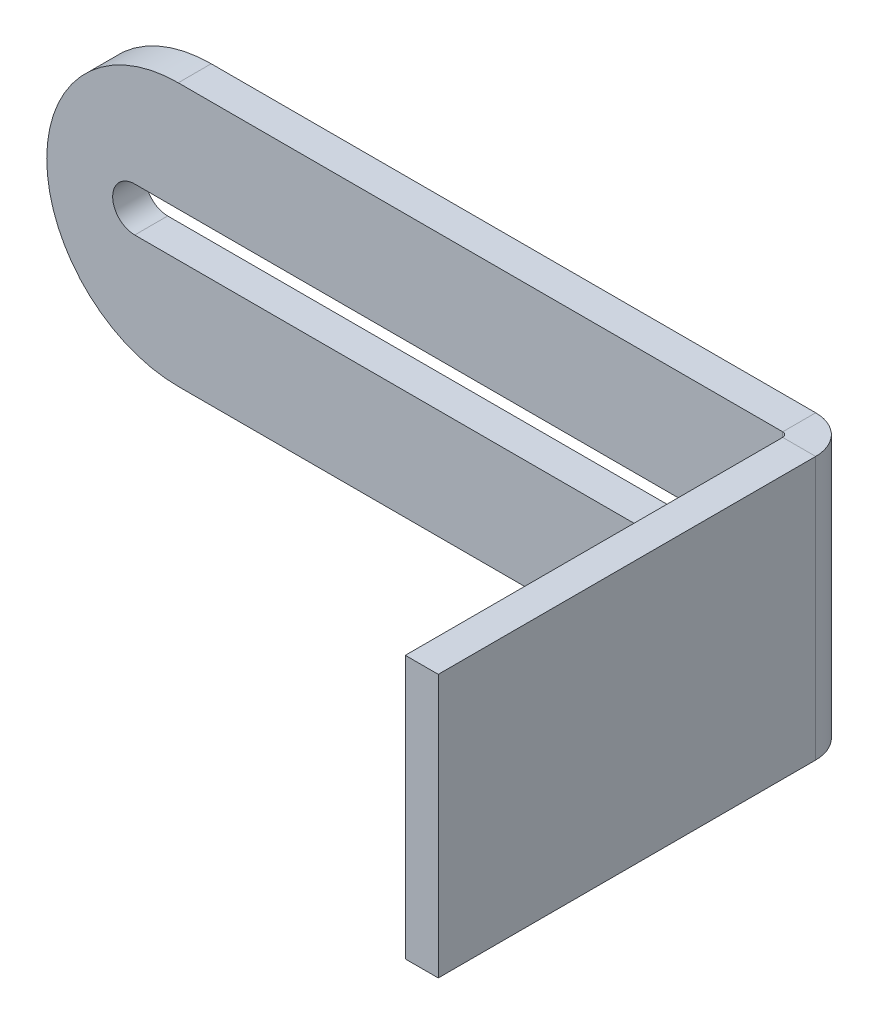
ISO-10303-21;
HEADER;
FILE_DESCRIPTION(('STEP AP214'),'2;1');
FILE_NAME('part.step','',(''),(''),'','','');
FILE_SCHEMA(('AUTOMOTIVE_DESIGN { 1 0 10303 214 1 1 1 1 }'));
ENDSEC;
DATA;
#1=APPLICATION_CONTEXT('core data for automotive mechanical design processes');
#2=APPLICATION_PROTOCOL_DEFINITION('international standard','automotive_design',2000,#1);
#3=PRODUCT_CONTEXT('',#1,'mechanical');
#4=PRODUCT('Part','Part','',(#3));
#5=PRODUCT_RELATED_PRODUCT_CATEGORY('part','',(#4));
#6=PRODUCT_DEFINITION_FORMATION('','',#4);
#7=PRODUCT_DEFINITION_CONTEXT('part definition',#1,'design');
#8=PRODUCT_DEFINITION('design','',#6,#7);
#9=PRODUCT_DEFINITION_SHAPE('','',#8);
#10=(LENGTH_UNIT() NAMED_UNIT(*) SI_UNIT(.MILLI.,.METRE.));
#11=(NAMED_UNIT(*) PLANE_ANGLE_UNIT() SI_UNIT($,.RADIAN.));
#12=(NAMED_UNIT(*) SI_UNIT($,.STERADIAN.) SOLID_ANGLE_UNIT());
#13=UNCERTAINTY_MEASURE_WITH_UNIT(LENGTH_MEASURE(1.E-05),#10,'distance_accuracy_value','');
#14=(GEOMETRIC_REPRESENTATION_CONTEXT(3) GLOBAL_UNCERTAINTY_ASSIGNED_CONTEXT((#13)) GLOBAL_UNIT_ASSIGNED_CONTEXT((#10,
#11,#12)) REPRESENTATION_CONTEXT('',''));
#15=CARTESIAN_POINT('',(0.,0.,0.));
#16=DIRECTION('',(0.,0.,1.));
#17=DIRECTION('',(1.,0.,0.));
#18=AXIS2_PLACEMENT_3D('',#15,#16,#17);
#19=CARTESIAN_POINT('',(0.,0.,-5.));
#20=DIRECTION('',(0.,0.,-1.));
#21=DIRECTION('',(-1.,0.,0.));
#22=AXIS2_PLACEMENT_3D('',#19,#20,#21);
#23=PLANE('',#22);
#24=DIRECTION('',(1.,0.,0.));
#25=VECTOR('',#24,1.);
#26=CARTESIAN_POINT('',(0.,3.35,-5.));
#27=LINE('',#26,#25);
#28=CARTESIAN_POINT('',(-45.35,3.35,-5.));
#29=VERTEX_POINT('',#28);
#30=CARTESIAN_POINT('',(42.8500000000002,3.35,-5.));
#31=VERTEX_POINT('',#30);
#32=EDGE_CURVE('E229',#29,#31,#27,.T.);
#33=ORIENTED_EDGE('',*,*,#32,.F.);
#34=CARTESIAN_POINT('',(-45.35,0.,-5.));
#35=DIRECTION('',(0.,0.,-1.));
#36=DIRECTION('',(-1.,0.,0.));
#37=AXIS2_PLACEMENT_3D('',#34,#35,#36);
#38=CIRCLE('',#37,3.35);
#39=CARTESIAN_POINT('',(-45.35,-3.35,-5.));
#40=VERTEX_POINT('',#39);
#41=EDGE_CURVE('E224',#40,#29,#38,.T.);
#42=ORIENTED_EDGE('',*,*,#41,.F.);
#43=DIRECTION('',(1.,0.,0.));
#44=VECTOR('',#43,1.);
#45=CARTESIAN_POINT('',(0.,-3.35,-5.));
#46=LINE('',#45,#44);
#47=CARTESIAN_POINT('',(42.8500000000002,-3.35,-5.));
#48=VERTEX_POINT('',#47);
#49=EDGE_CURVE('E199',#40,#48,#46,.T.);
#50=ORIENTED_EDGE('',*,*,#49,.T.);
#51=CARTESIAN_POINT('',(42.8500000000002,0.,-5.));
#52=DIRECTION('',(0.,0.,-1.));
#53=DIRECTION('',(-1.,0.,0.));
#54=AXIS2_PLACEMENT_3D('',#51,#52,#53);
#55=CIRCLE('',#54,3.35);
#56=EDGE_CURVE('E227',#31,#48,#55,.T.);
#57=ORIENTED_EDGE('',*,*,#56,.F.);
#58=EDGE_LOOP('',(#33,#42,#50,#57));
#59=FACE_BOUND('',#58,.T.);
#60=DIRECTION('',(1.,0.,0.));
#61=VECTOR('',#60,1.);
#62=CARTESIAN_POINT('',(-58.7,-19.95,-5.));
#63=LINE('',#62,#61);
#64=CARTESIAN_POINT('',(-38.75,-19.95,-5.));
#65=VERTEX_POINT('',#64);
#66=CARTESIAN_POINT('',(52.9634,-19.95,-5.));
#67=VERTEX_POINT('',#66);
#68=EDGE_CURVE('E13',#65,#67,#63,.T.);
#69=ORIENTED_EDGE('',*,*,#68,.F.);
#70=CARTESIAN_POINT('',(-38.75,0.,-5.));
#71=DIRECTION('',(0.,0.,-1.));
#72=DIRECTION('',(-1.,0.,0.));
#73=AXIS2_PLACEMENT_3D('',#70,#71,#72);
#74=CIRCLE('',#73,19.95);
#75=CARTESIAN_POINT('',(-38.75,19.95,-5.));
#76=VERTEX_POINT('',#75);
#77=EDGE_CURVE('E236',#65,#76,#74,.T.);
#78=ORIENTED_EDGE('',*,*,#77,.T.);
#79=DIRECTION('',(-1.,0.,0.));
#80=VECTOR('',#79,1.);
#81=CARTESIAN_POINT('',(-58.7,19.95,-5.));
#82=LINE('',#81,#80);
#83=CARTESIAN_POINT('',(52.9634,19.95,-5.));
#84=VERTEX_POINT('',#83);
#85=EDGE_CURVE('E112',#84,#76,#82,.T.);
#86=ORIENTED_EDGE('',*,*,#85,.F.);
#87=DIRECTION('',(0.,1.,0.));
#88=VECTOR('',#87,1.);
#89=CARTESIAN_POINT('',(52.9634,19.95,-5.));
#90=LINE('',#89,#88);
#91=EDGE_CURVE('E272',#84,#67,#90,.F.);
#92=ORIENTED_EDGE('',*,*,#91,.T.);
#93=EDGE_LOOP('',(#69,#78,#86,#92));
#94=FACE_BOUND('',#93,.T.);
#95=ADVANCED_FACE('F103',(#59,#94),#23,.T.);
#96=CARTESIAN_POINT('',(0.,0.,0.));
#97=DIRECTION('',(0.,0.,-1.));
#98=DIRECTION('',(-1.,0.,0.));
#99=AXIS2_PLACEMENT_3D('',#96,#97,#98);
#100=PLANE('',#99);
#101=CARTESIAN_POINT('',(-45.35,0.,0.));
#102=DIRECTION('',(0.,0.,1.));
#103=DIRECTION('',(1.,0.,0.));
#104=AXIS2_PLACEMENT_3D('',#101,#102,#103);
#105=CIRCLE('',#104,3.35);
#106=CARTESIAN_POINT('',(-45.35,3.35,0.));
#107=VERTEX_POINT('',#106);
#108=CARTESIAN_POINT('',(-45.35,-3.35,0.));
#109=VERTEX_POINT('',#108);
#110=EDGE_CURVE('E205',#107,#109,#105,.T.);
#111=ORIENTED_EDGE('',*,*,#110,.F.);
#112=DIRECTION('',(-1.,0.,0.));
#113=VECTOR('',#112,1.);
#114=CARTESIAN_POINT('',(0.,3.35,0.));
#115=LINE('',#114,#113);
#116=CARTESIAN_POINT('',(42.8500000000002,3.35,0.));
#117=VERTEX_POINT('',#116);
#118=EDGE_CURVE('E128',#117,#107,#115,.T.);
#119=ORIENTED_EDGE('',*,*,#118,.F.);
#120=CARTESIAN_POINT('',(42.8500000000002,0.,0.));
#121=DIRECTION('',(0.,0.,1.));
#122=DIRECTION('',(1.,0.,0.));
#123=AXIS2_PLACEMENT_3D('',#120,#121,#122);
#124=CIRCLE('',#123,3.35);
#125=CARTESIAN_POINT('',(42.8500000000002,-3.35,0.));
#126=VERTEX_POINT('',#125);
#127=EDGE_CURVE('E212',#126,#117,#124,.T.);
#128=ORIENTED_EDGE('',*,*,#127,.F.);
#129=DIRECTION('',(-1.,0.,0.));
#130=VECTOR('',#129,1.);
#131=CARTESIAN_POINT('',(0.,-3.35,0.));
#132=LINE('',#131,#130);
#133=EDGE_CURVE('E196',#126,#109,#132,.T.);
#134=ORIENTED_EDGE('',*,*,#133,.T.);
#135=EDGE_LOOP('',(#111,#119,#128,#134));
#136=FACE_BOUND('',#135,.T.);
#137=CARTESIAN_POINT('',(-38.75,0.,0.));
#138=DIRECTION('',(0.,0.,1.));
#139=DIRECTION('',(1.,0.,0.));
#140=AXIS2_PLACEMENT_3D('',#137,#138,#139);
#141=CIRCLE('',#140,19.95);
#142=CARTESIAN_POINT('',(-38.75,19.95,0.));
#143=VERTEX_POINT('',#142);
#144=CARTESIAN_POINT('',(-38.75,-19.95,0.));
#145=VERTEX_POINT('',#144);
#146=EDGE_CURVE('E231',#143,#145,#141,.T.);
#147=ORIENTED_EDGE('',*,*,#146,.T.);
#148=DIRECTION('',(1.,0.,0.));
#149=VECTOR('',#148,1.);
#150=CARTESIAN_POINT('',(-58.7,-19.95,0.));
#151=LINE('',#150,#149);
#152=CARTESIAN_POINT('',(52.9634,-19.95,0.));
#153=VERTEX_POINT('',#152);
#154=EDGE_CURVE('E107',#145,#153,#151,.T.);
#155=ORIENTED_EDGE('',*,*,#154,.T.);
#156=DIRECTION('',(0.,1.,0.));
#157=VECTOR('',#156,1.);
#158=CARTESIAN_POINT('',(52.9634,19.95,0.));
#159=LINE('',#158,#157);
#160=CARTESIAN_POINT('',(52.9634,19.95,0.));
#161=VERTEX_POINT('',#160);
#162=EDGE_CURVE('E285',#161,#153,#159,.F.);
#163=ORIENTED_EDGE('',*,*,#162,.F.);
#164=DIRECTION('',(-1.,0.,0.));
#165=VECTOR('',#164,1.);
#166=CARTESIAN_POINT('',(-58.7,19.95,0.));
#167=LINE('',#166,#165);
#168=EDGE_CURVE('E293',#161,#143,#167,.T.);
#169=ORIENTED_EDGE('',*,*,#168,.T.);
#170=EDGE_LOOP('',(#147,#155,#163,#169));
#171=FACE_BOUND('',#170,.T.);
#172=ADVANCED_FACE('F209',(#136,#171),#100,.F.);
#173=CARTESIAN_POINT('',(-58.7,19.95,-5.));
#174=DIRECTION('',(0.,1.,0.));
#175=DIRECTION('',(0.,0.,1.));
#176=AXIS2_PLACEMENT_3D('',#173,#174,#175);
#177=PLANE('',#176);
#178=ORIENTED_EDGE('',*,*,#85,.T.);
#179=DIRECTION('',(0.,0.,1.));
#180=VECTOR('',#179,1.);
#181=CARTESIAN_POINT('',(-38.75,19.95,-10.));
#182=LINE('',#181,#180);
#183=EDGE_CURVE('E233',#76,#143,#182,.T.);
#184=ORIENTED_EDGE('',*,*,#183,.T.);
#185=ORIENTED_EDGE('',*,*,#168,.F.);
#186=DIRECTION('',(0.,0.,-1.));
#187=VECTOR('',#186,1.);
#188=CARTESIAN_POINT('',(52.9634,19.95,0.));
#189=LINE('',#188,#187);
#190=EDGE_CURVE('E279',#161,#84,#189,.T.);
#191=ORIENTED_EDGE('',*,*,#190,.T.);
#192=EDGE_LOOP('',(#178,#184,#185,#191));
#193=FACE_BOUND('',#192,.T.);
#194=ADVANCED_FACE('F105',(#193),#177,.T.);
#195=CARTESIAN_POINT('',(-58.7,-19.95,-5.));
#196=DIRECTION('',(0.,-1.,0.));
#197=DIRECTION('',(0.,0.,-1.));
#198=AXIS2_PLACEMENT_3D('',#195,#196,#197);
#199=PLANE('',#198);
#200=DIRECTION('',(0.,0.,1.));
#201=VECTOR('',#200,1.);
#202=CARTESIAN_POINT('',(-38.75,-19.95,-10.));
#203=LINE('',#202,#201);
#204=EDGE_CURVE('E219',#65,#145,#203,.T.);
#205=ORIENTED_EDGE('',*,*,#204,.F.);
#206=ORIENTED_EDGE('',*,*,#68,.T.);
#207=DIRECTION('',(0.,0.,-1.));
#208=VECTOR('',#207,1.);
#209=CARTESIAN_POINT('',(52.9634,-19.95,0.));
#210=LINE('',#209,#208);
#211=EDGE_CURVE('E290',#153,#67,#210,.T.);
#212=ORIENTED_EDGE('',*,*,#211,.F.);
#213=ORIENTED_EDGE('',*,*,#154,.F.);
#214=EDGE_LOOP('',(#205,#206,#212,#213));
#215=FACE_BOUND('',#214,.T.);
#216=ADVANCED_FACE('F311',(#215),#199,.T.);
#217=CARTESIAN_POINT('',(52.9634,-19.95,0.7366));
#218=DIRECTION('',(0.,-1.,0.));
#219=DIRECTION('',(0.,0.,-1.));
#220=AXIS2_PLACEMENT_3D('',#217,#218,#219);
#221=PLANE('',#220);
#222=DIRECTION('',(1.,0.,0.));
#223=VECTOR('',#222,1.);
#224=CARTESIAN_POINT('',(58.7,-19.95,0.736599999999976));
#225=LINE('',#224,#223);
#226=CARTESIAN_POINT('',(53.7,-19.95,0.736599999999997));
#227=VERTEX_POINT('',#226);
#228=CARTESIAN_POINT('',(58.7,-19.95,0.736599999999979));
#229=VERTEX_POINT('',#228);
#230=EDGE_CURVE('E239',#227,#229,#225,.T.);
#231=ORIENTED_EDGE('',*,*,#230,.F.);
#232=CARTESIAN_POINT('',(52.9634,-19.95,0.7366));
#233=DIRECTION('',(0.,1.,0.));
#234=DIRECTION('',(0.,0.,1.));
#235=AXIS2_PLACEMENT_3D('',#232,#233,#234);
#236=CIRCLE('',#235,0.736600000000004);
#237=EDGE_CURVE('E282',#153,#227,#236,.F.);
#238=ORIENTED_EDGE('',*,*,#237,.F.);
#239=ORIENTED_EDGE('',*,*,#211,.T.);
#240=CARTESIAN_POINT('',(52.9634,-19.95,0.7366));
#241=DIRECTION('',(0.,1.,0.));
#242=DIRECTION('',(0.,0.,1.));
#243=AXIS2_PLACEMENT_3D('',#240,#241,#242);
#244=CIRCLE('',#243,5.7366);
#245=EDGE_CURVE('E275',#67,#229,#244,.F.);
#246=ORIENTED_EDGE('',*,*,#245,.T.);
#247=EDGE_LOOP('',(#231,#238,#239,#246));
#248=FACE_BOUND('',#247,.T.);
#249=ADVANCED_FACE('F310',(#248),#221,.T.);
#250=CARTESIAN_POINT('',(52.9634,19.95,0.7366));
#251=DIRECTION('',(0.,-1.,0.));
#252=DIRECTION('',(0.,0.,-1.));
#253=AXIS2_PLACEMENT_3D('',#250,#251,#252);
#254=PLANE('',#253);
#255=CARTESIAN_POINT('',(52.9634,19.95,0.7366));
#256=DIRECTION('',(0.,1.,0.));
#257=DIRECTION('',(0.,0.,1.));
#258=AXIS2_PLACEMENT_3D('',#255,#256,#257);
#259=CIRCLE('',#258,0.736600000000004);
#260=CARTESIAN_POINT('',(53.7,19.95,0.736599999999997));
#261=VERTEX_POINT('',#260);
#262=EDGE_CURVE('E242',#261,#161,#259,.T.);
#263=ORIENTED_EDGE('',*,*,#262,.F.);
#264=DIRECTION('',(1.,0.,0.));
#265=VECTOR('',#264,1.);
#266=CARTESIAN_POINT('',(53.7,19.95,0.736599999999997));
#267=LINE('',#266,#265);
#268=CARTESIAN_POINT('',(58.7,19.95,0.736599999999979));
#269=VERTEX_POINT('',#268);
#270=EDGE_CURVE('E265',#261,#269,#267,.T.);
#271=ORIENTED_EDGE('',*,*,#270,.T.);
#272=CARTESIAN_POINT('',(52.9634,19.95,0.7366));
#273=DIRECTION('',(0.,1.,0.));
#274=DIRECTION('',(0.,0.,1.));
#275=AXIS2_PLACEMENT_3D('',#272,#273,#274);
#276=CIRCLE('',#275,5.7366);
#277=EDGE_CURVE('E276',#269,#84,#276,.T.);
#278=ORIENTED_EDGE('',*,*,#277,.T.);
#279=ORIENTED_EDGE('',*,*,#190,.F.);
#280=EDGE_LOOP('',(#263,#271,#278,#279));
#281=FACE_BOUND('',#280,.T.);
#282=ADVANCED_FACE('F336',(#281),#254,.F.);
#283=CARTESIAN_POINT('',(52.9634,19.95,0.7366));
#284=DIRECTION('',(0.,1.,0.));
#285=DIRECTION('',(1.,0.,0.));
#286=AXIS2_PLACEMENT_3D('',#283,#284,#285);
#287=CYLINDRICAL_SURFACE('',#286,5.7366);
#288=ORIENTED_EDGE('',*,*,#91,.F.);
#289=ORIENTED_EDGE('',*,*,#277,.F.);
#290=DIRECTION('',(0.,1.,0.));
#291=VECTOR('',#290,1.);
#292=CARTESIAN_POINT('',(58.7,0.,0.736599999999979));
#293=LINE('',#292,#291);
#294=EDGE_CURVE('E262',#229,#269,#293,.T.);
#295=ORIENTED_EDGE('',*,*,#294,.F.);
#296=ORIENTED_EDGE('',*,*,#245,.F.);
#297=EDGE_LOOP('',(#288,#289,#295,#296));
#298=FACE_BOUND('',#297,.T.);
#299=ADVANCED_FACE('F316',(#298),#287,.T.);
#300=CARTESIAN_POINT('',(52.9634,19.95,0.7366));
#301=DIRECTION('',(0.,1.,0.));
#302=DIRECTION('',(1.,0.,0.));
#303=AXIS2_PLACEMENT_3D('',#300,#301,#302);
#304=CYLINDRICAL_SURFACE('',#303,0.736600000000004);
#305=ORIENTED_EDGE('',*,*,#162,.T.);
#306=ORIENTED_EDGE('',*,*,#237,.T.);
#307=DIRECTION('',(0.,-1.,0.));
#308=VECTOR('',#307,1.);
#309=CARTESIAN_POINT('',(53.7,-19.95,0.736599999999997));
#310=LINE('',#309,#308);
#311=EDGE_CURVE('E268',#227,#261,#310,.F.);
#312=ORIENTED_EDGE('',*,*,#311,.T.);
#313=ORIENTED_EDGE('',*,*,#262,.T.);
#314=EDGE_LOOP('',(#305,#306,#312,#313));
#315=FACE_BOUND('',#314,.T.);
#316=ADVANCED_FACE('F306',(#315),#304,.F.);
#317=CARTESIAN_POINT('',(58.7,19.95,0.));
#318=DIRECTION('',(0.,1.,0.));
#319=DIRECTION('',(0.,0.,1.));
#320=AXIS2_PLACEMENT_3D('',#317,#318,#319);
#321=PLANE('',#320);
#322=DIRECTION('',(0.,0.,-1.));
#323=VECTOR('',#322,1.);
#324=CARTESIAN_POINT('',(58.7,19.95,0.));
#325=LINE('',#324,#323);
#326=CARTESIAN_POINT('',(58.7000000000002,19.95,58.));
#327=VERTEX_POINT('',#326);
#328=EDGE_CURVE('E246',#327,#269,#325,.T.);
#329=ORIENTED_EDGE('',*,*,#328,.T.);
#330=ORIENTED_EDGE('',*,*,#270,.F.);
#331=DIRECTION('',(0.,0.,1.));
#332=VECTOR('',#331,1.);
#333=CARTESIAN_POINT('',(53.7,19.95,-2.03656536079677E-13));
#334=LINE('',#333,#332);
#335=CARTESIAN_POINT('',(53.7000000000002,19.95,58.));
#336=VERTEX_POINT('',#335);
#337=EDGE_CURVE('E254',#336,#261,#334,.F.);
#338=ORIENTED_EDGE('',*,*,#337,.F.);
#339=DIRECTION('',(-1.,0.,0.));
#340=VECTOR('',#339,1.);
#341=CARTESIAN_POINT('',(58.7000000000002,19.95,58.));
#342=LINE('',#341,#340);
#343=EDGE_CURVE('E240',#327,#336,#342,.T.);
#344=ORIENTED_EDGE('',*,*,#343,.F.);
#345=EDGE_LOOP('',(#329,#330,#338,#344));
#346=FACE_BOUND('',#345,.T.);
#347=ADVANCED_FACE('F334',(#346),#321,.T.);
#348=CARTESIAN_POINT('',(58.7000000000002,-19.95,58.));
#349=DIRECTION('',(0.,-1.,0.));
#350=DIRECTION('',(0.,0.,-1.));
#351=AXIS2_PLACEMENT_3D('',#348,#349,#350);
#352=PLANE('',#351);
#353=DIRECTION('',(0.,0.,-1.));
#354=VECTOR('',#353,1.);
#355=CARTESIAN_POINT('',(53.7,-19.95,-2.03656536079677E-13));
#356=LINE('',#355,#354);
#357=CARTESIAN_POINT('',(53.7000000000002,-19.95,58.));
#358=VERTEX_POINT('',#357);
#359=EDGE_CURVE('E260',#227,#358,#356,.F.);
#360=ORIENTED_EDGE('',*,*,#359,.F.);
#361=ORIENTED_EDGE('',*,*,#230,.T.);
#362=DIRECTION('',(0.,0.,1.));
#363=VECTOR('',#362,1.);
#364=CARTESIAN_POINT('',(58.7000000000002,-19.95,58.));
#365=LINE('',#364,#363);
#366=CARTESIAN_POINT('',(58.7000000000002,-19.95,58.));
#367=VERTEX_POINT('',#366);
#368=EDGE_CURVE('E252',#229,#367,#365,.T.);
#369=ORIENTED_EDGE('',*,*,#368,.T.);
#370=DIRECTION('',(-1.,0.,0.));
#371=VECTOR('',#370,1.);
#372=CARTESIAN_POINT('',(58.7000000000002,-19.95,58.));
#373=LINE('',#372,#371);
#374=EDGE_CURVE('E243',#367,#358,#373,.T.);
#375=ORIENTED_EDGE('',*,*,#374,.T.);
#376=EDGE_LOOP('',(#360,#361,#369,#375));
#377=FACE_BOUND('',#376,.T.);
#378=ADVANCED_FACE('F320',(#377),#352,.T.);
#379=CARTESIAN_POINT('',(58.7,0.,-2.21113942773893E-13));
#380=DIRECTION('',(1.,0.,0.));
#381=DIRECTION('',(0.,0.,-1.));
#382=AXIS2_PLACEMENT_3D('',#379,#380,#381);
#383=PLANE('',#382);
#384=ORIENTED_EDGE('',*,*,#368,.F.);
#385=ORIENTED_EDGE('',*,*,#294,.T.);
#386=ORIENTED_EDGE('',*,*,#328,.F.);
#387=DIRECTION('',(0.,1.,0.));
#388=VECTOR('',#387,1.);
#389=CARTESIAN_POINT('',(58.7000000000002,19.95,58.));
#390=LINE('',#389,#388);
#391=EDGE_CURVE('E249',#367,#327,#390,.T.);
#392=ORIENTED_EDGE('',*,*,#391,.F.);
#393=EDGE_LOOP('',(#384,#385,#386,#392));
#394=FACE_BOUND('',#393,.T.);
#395=ADVANCED_FACE('F324',(#394),#383,.T.);
#396=CARTESIAN_POINT('',(53.7,0.,-2.03656536079677E-13));
#397=DIRECTION('',(1.,0.,0.));
#398=DIRECTION('',(0.,0.,-1.));
#399=AXIS2_PLACEMENT_3D('',#396,#397,#398);
#400=PLANE('',#399);
#401=ORIENTED_EDGE('',*,*,#311,.F.);
#402=ORIENTED_EDGE('',*,*,#359,.T.);
#403=DIRECTION('',(0.,-1.,0.));
#404=VECTOR('',#403,1.);
#405=CARTESIAN_POINT('',(53.7000000000002,0.,58.));
#406=LINE('',#405,#404);
#407=EDGE_CURVE('E257',#358,#336,#406,.F.);
#408=ORIENTED_EDGE('',*,*,#407,.T.);
#409=ORIENTED_EDGE('',*,*,#337,.T.);
#410=EDGE_LOOP('',(#401,#402,#408,#409));
#411=FACE_BOUND('',#410,.T.);
#412=ADVANCED_FACE('F331',(#411),#400,.F.);
#413=CARTESIAN_POINT('',(58.7000000000002,19.95,58.));
#414=DIRECTION('',(0.,0.,1.));
#415=DIRECTION('',(1.,0.,0.));
#416=AXIS2_PLACEMENT_3D('',#413,#414,#415);
#417=PLANE('',#416);
#418=ORIENTED_EDGE('',*,*,#407,.F.);
#419=ORIENTED_EDGE('',*,*,#374,.F.);
#420=ORIENTED_EDGE('',*,*,#391,.T.);
#421=ORIENTED_EDGE('',*,*,#343,.T.);
#422=EDGE_LOOP('',(#418,#419,#420,#421));
#423=FACE_BOUND('',#422,.T.);
#424=ADVANCED_FACE('F328',(#423),#417,.T.);
#425=CARTESIAN_POINT('',(-38.75,0.,-10.));
#426=DIRECTION('',(0.,0.,1.));
#427=DIRECTION('',(1.,0.,0.));
#428=AXIS2_PLACEMENT_3D('',#425,#426,#427);
#429=CYLINDRICAL_SURFACE('',#428,19.95);
#430=ORIENTED_EDGE('',*,*,#77,.F.);
#431=ORIENTED_EDGE('',*,*,#204,.T.);
#432=ORIENTED_EDGE('',*,*,#146,.F.);
#433=ORIENTED_EDGE('',*,*,#183,.F.);
#434=EDGE_LOOP('',(#430,#431,#432,#433));
#435=FACE_BOUND('',#434,.T.);
#436=ADVANCED_FACE('F340',(#435),#429,.T.);
#437=CARTESIAN_POINT('',(0.,3.35,-10.));
#438=DIRECTION('',(0.,1.,0.));
#439=DIRECTION('',(0.,0.,1.));
#440=AXIS2_PLACEMENT_3D('',#437,#438,#439);
#441=PLANE('',#440);
#442=ORIENTED_EDGE('',*,*,#32,.T.);
#443=DIRECTION('',(0.,0.,1.));
#444=VECTOR('',#443,1.);
#445=CARTESIAN_POINT('',(42.8500000000002,3.35,-10.));
#446=LINE('',#445,#444);
#447=EDGE_CURVE('E217',#31,#117,#446,.T.);
#448=ORIENTED_EDGE('',*,*,#447,.T.);
#449=ORIENTED_EDGE('',*,*,#118,.T.);
#450=DIRECTION('',(0.,0.,1.));
#451=VECTOR('',#450,1.);
#452=CARTESIAN_POINT('',(-45.35,3.35,-10.));
#453=LINE('',#452,#451);
#454=EDGE_CURVE('E202',#29,#107,#453,.T.);
#455=ORIENTED_EDGE('',*,*,#454,.F.);
#456=EDGE_LOOP('',(#442,#448,#449,#455));
#457=FACE_BOUND('',#456,.T.);
#458=ADVANCED_FACE('F342',(#457),#441,.F.);
#459=CARTESIAN_POINT('',(42.8500000000002,0.,-10.));
#460=DIRECTION('',(0.,0.,1.));
#461=DIRECTION('',(1.,0.,0.));
#462=AXIS2_PLACEMENT_3D('',#459,#460,#461);
#463=CYLINDRICAL_SURFACE('',#462,3.35);
#464=ORIENTED_EDGE('',*,*,#56,.T.);
#465=DIRECTION('',(0.,0.,1.));
#466=VECTOR('',#465,1.);
#467=CARTESIAN_POINT('',(42.8500000000002,-3.35,-10.));
#468=LINE('',#467,#466);
#469=EDGE_CURVE('E201',#48,#126,#468,.T.);
#470=ORIENTED_EDGE('',*,*,#469,.T.);
#471=ORIENTED_EDGE('',*,*,#127,.T.);
#472=ORIENTED_EDGE('',*,*,#447,.F.);
#473=EDGE_LOOP('',(#464,#470,#471,#472));
#474=FACE_BOUND('',#473,.T.);
#475=ADVANCED_FACE('F348',(#474),#463,.F.);
#476=CARTESIAN_POINT('',(0.,-3.35,-10.));
#477=DIRECTION('',(0.,1.,0.));
#478=DIRECTION('',(0.,0.,1.));
#479=AXIS2_PLACEMENT_3D('',#476,#477,#478);
#480=PLANE('',#479);
#481=DIRECTION('',(0.,0.,1.));
#482=VECTOR('',#481,1.);
#483=CARTESIAN_POINT('',(-45.35,-3.35,-10.));
#484=LINE('',#483,#482);
#485=EDGE_CURVE('E120',#40,#109,#484,.T.);
#486=ORIENTED_EDGE('',*,*,#485,.T.);
#487=ORIENTED_EDGE('',*,*,#133,.F.);
#488=ORIENTED_EDGE('',*,*,#469,.F.);
#489=ORIENTED_EDGE('',*,*,#49,.F.);
#490=EDGE_LOOP('',(#486,#487,#488,#489));
#491=FACE_BOUND('',#490,.T.);
#492=ADVANCED_FACE('F193',(#491),#480,.T.);
#493=CARTESIAN_POINT('',(-45.35,0.,-10.));
#494=DIRECTION('',(0.,0.,1.));
#495=DIRECTION('',(1.,0.,0.));
#496=AXIS2_PLACEMENT_3D('',#493,#494,#495);
#497=CYLINDRICAL_SURFACE('',#496,3.35);
#498=ORIENTED_EDGE('',*,*,#41,.T.);
#499=ORIENTED_EDGE('',*,*,#454,.T.);
#500=ORIENTED_EDGE('',*,*,#110,.T.);
#501=ORIENTED_EDGE('',*,*,#485,.F.);
#502=EDGE_LOOP('',(#498,#499,#500,#501));
#503=FACE_BOUND('',#502,.T.);
#504=ADVANCED_FACE('F206',(#503),#497,.F.);
#505=CLOSED_SHELL('',(#95,#172,#194,#216,#249,#282,#299,#316,#347,#378,#395,#412,#424,#436,#458,
#475,#492,#504));
#506=MANIFOLD_SOLID_BREP('B2',#505);
#507=ADVANCED_BREP_SHAPE_REPRESENTATION('',(#18,#506),#14);
#508=SHAPE_DEFINITION_REPRESENTATION(#9,#507);
ENDSEC;
END-ISO-10303-21;
